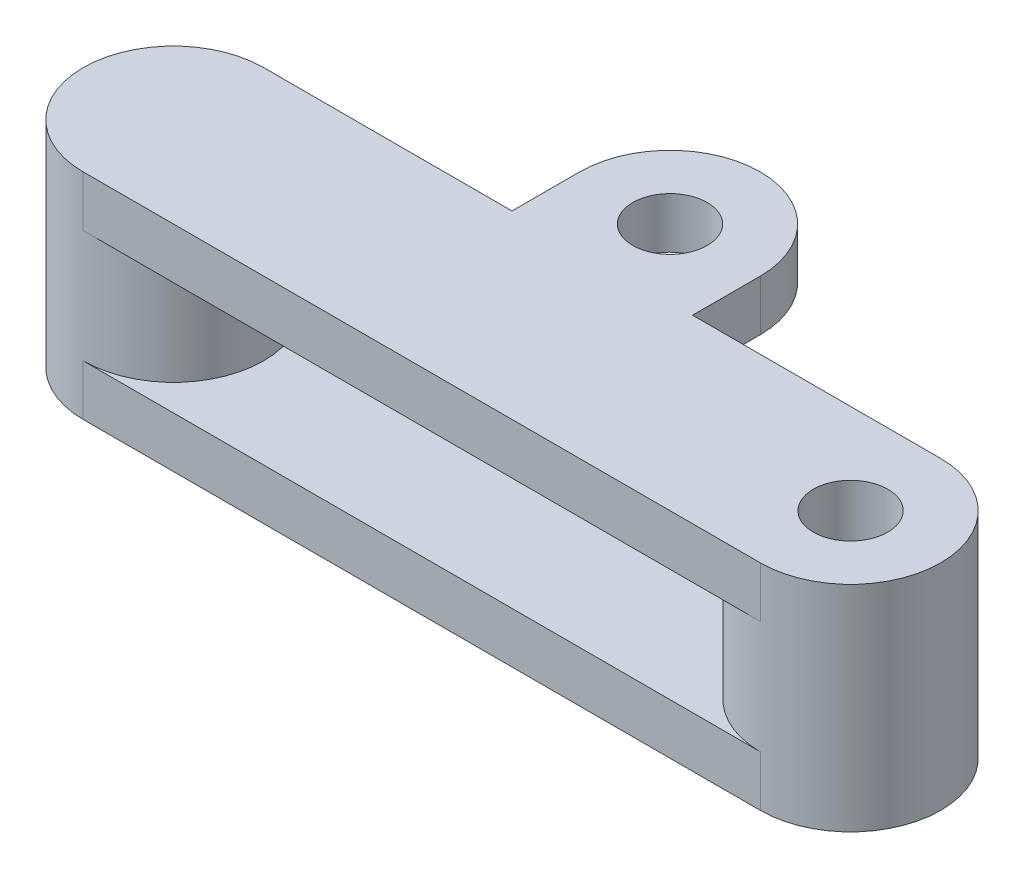
ISO-10303-21;
HEADER;
FILE_DESCRIPTION(('STEP AP214'),'2;1');
FILE_NAME('part.step','',(''),(''),'','','');
FILE_SCHEMA(('AUTOMOTIVE_DESIGN { 1 0 10303 214 1 1 1 1 }'));
ENDSEC;
DATA;
#1=APPLICATION_CONTEXT('core data for automotive mechanical design processes');
#2=APPLICATION_PROTOCOL_DEFINITION('international standard','automotive_design',2000,#1);
#3=PRODUCT_CONTEXT('',#1,'mechanical');
#4=PRODUCT('Part','Part','',(#3));
#5=PRODUCT_RELATED_PRODUCT_CATEGORY('part','',(#4));
#6=PRODUCT_DEFINITION_FORMATION('','',#4);
#7=PRODUCT_DEFINITION_CONTEXT('part definition',#1,'design');
#8=PRODUCT_DEFINITION('design','',#6,#7);
#9=PRODUCT_DEFINITION_SHAPE('','',#8);
#10=(LENGTH_UNIT() NAMED_UNIT(*) SI_UNIT(.MILLI.,.METRE.));
#11=(NAMED_UNIT(*) PLANE_ANGLE_UNIT() SI_UNIT($,.RADIAN.));
#12=(NAMED_UNIT(*) SI_UNIT($,.STERADIAN.) SOLID_ANGLE_UNIT());
#13=UNCERTAINTY_MEASURE_WITH_UNIT(LENGTH_MEASURE(1.E-05),#10,'distance_accuracy_value','');
#14=(GEOMETRIC_REPRESENTATION_CONTEXT(3) GLOBAL_UNCERTAINTY_ASSIGNED_CONTEXT((#13)) GLOBAL_UNIT_ASSIGNED_CONTEXT((#10,
#11,#12)) REPRESENTATION_CONTEXT('',''));
#15=CARTESIAN_POINT('',(0.,0.,0.));
#16=DIRECTION('',(0.,0.,1.));
#17=DIRECTION('',(1.,0.,0.));
#18=AXIS2_PLACEMENT_3D('',#15,#16,#17);
#19=CARTESIAN_POINT('',(0.,9.5,-4.));
#20=DIRECTION('',(0.,0.,1.));
#21=DIRECTION('',(1.,0.,0.));
#22=AXIS2_PLACEMENT_3D('',#19,#20,#21);
#23=PLANE('',#22);
#24=DIRECTION('',(-1.,0.,0.));
#25=VECTOR('',#24,1.);
#26=CARTESIAN_POINT('',(0.,2.25,-4.));
#27=LINE('',#26,#25);
#28=CARTESIAN_POINT('',(0.,2.25,-4.));
#29=VERTEX_POINT('',#28);
#30=CARTESIAN_POINT('',(-11.,2.25,-4.));
#31=VERTEX_POINT('',#30);
#32=EDGE_CURVE('E158',#29,#31,#27,.T.);
#33=ORIENTED_EDGE('',*,*,#32,.F.);
#34=DIRECTION('',(0.,-1.,0.));
#35=VECTOR('',#34,1.);
#36=CARTESIAN_POINT('',(0.,9.5,-4.));
#37=LINE('',#36,#35);
#38=CARTESIAN_POINT('',(0.,0.,-4.));
#39=VERTEX_POINT('',#38);
#40=EDGE_CURVE('E53',#29,#39,#37,.T.);
#41=ORIENTED_EDGE('',*,*,#40,.T.);
#42=DIRECTION('',(-1.,0.,0.));
#43=VECTOR('',#42,1.);
#44=CARTESIAN_POINT('',(0.,0.,-4.));
#45=LINE('',#44,#43);
#46=CARTESIAN_POINT('',(-11.,0.,-4.));
#47=VERTEX_POINT('',#46);
#48=EDGE_CURVE('E251',#39,#47,#45,.T.);
#49=ORIENTED_EDGE('',*,*,#48,.T.);
#50=DIRECTION('',(0.,-1.,0.));
#51=VECTOR('',#50,1.);
#52=CARTESIAN_POINT('',(-11.,9.5,-4.));
#53=LINE('',#52,#51);
#54=EDGE_CURVE('E170',#31,#47,#53,.T.);
#55=ORIENTED_EDGE('',*,*,#54,.F.);
#56=EDGE_LOOP('',(#33,#41,#49,#55));
#57=FACE_BOUND('',#56,.T.);
#58=ADVANCED_FACE('F43',(#57),#23,.F.);
#59=CARTESIAN_POINT('',(-11.,9.5,-7.));
#60=DIRECTION('',(-1.,0.,0.));
#61=DIRECTION('',(0.,0.,1.));
#62=AXIS2_PLACEMENT_3D('',#59,#60,#61);
#63=PLANE('',#62);
#64=DIRECTION('',(0.,0.,-1.));
#65=VECTOR('',#64,1.);
#66=CARTESIAN_POINT('',(-11.,2.25,-4.));
#67=LINE('',#66,#65);
#68=CARTESIAN_POINT('',(-11.,2.25,-7.));
#69=VERTEX_POINT('',#68);
#70=EDGE_CURVE('E172',#31,#69,#67,.T.);
#71=ORIENTED_EDGE('',*,*,#70,.F.);
#72=ORIENTED_EDGE('',*,*,#54,.T.);
#73=DIRECTION('',(0.,0.,-1.));
#74=VECTOR('',#73,1.);
#75=CARTESIAN_POINT('',(-11.,0.,-7.));
#76=LINE('',#75,#74);
#77=CARTESIAN_POINT('',(-11.,0.,-7.));
#78=VERTEX_POINT('',#77);
#79=EDGE_CURVE('E254',#47,#78,#76,.T.);
#80=ORIENTED_EDGE('',*,*,#79,.T.);
#81=DIRECTION('',(0.,-1.,0.));
#82=VECTOR('',#81,1.);
#83=CARTESIAN_POINT('',(-11.,9.5,-7.));
#84=LINE('',#83,#82);
#85=EDGE_CURVE('E298',#69,#78,#84,.T.);
#86=ORIENTED_EDGE('',*,*,#85,.F.);
#87=EDGE_LOOP('',(#71,#72,#80,#86));
#88=FACE_BOUND('',#87,.T.);
#89=ADVANCED_FACE('F318',(#88),#63,.F.);
#90=CARTESIAN_POINT('',(-15.,9.5,-7.));
#91=DIRECTION('',(0.,-1.,0.));
#92=DIRECTION('',(0.,0.,-1.));
#93=AXIS2_PLACEMENT_3D('',#90,#91,#92);
#94=CYLINDRICAL_SURFACE('',#93,4.);
#95=CARTESIAN_POINT('',(-15.,2.25,-7.));
#96=DIRECTION('',(0.,1.,0.));
#97=DIRECTION('',(0.,0.,1.));
#98=AXIS2_PLACEMENT_3D('',#95,#96,#97);
#99=CIRCLE('',#98,4.);
#100=CARTESIAN_POINT('',(-19.,2.25,-7.));
#101=VERTEX_POINT('',#100);
#102=EDGE_CURVE('E315',#69,#101,#99,.T.);
#103=ORIENTED_EDGE('',*,*,#102,.F.);
#104=ORIENTED_EDGE('',*,*,#85,.T.);
#105=CARTESIAN_POINT('',(-15.,0.,-7.));
#106=DIRECTION('',(0.,1.,0.));
#107=DIRECTION('',(0.,0.,1.));
#108=AXIS2_PLACEMENT_3D('',#105,#106,#107);
#109=CIRCLE('',#108,4.);
#110=CARTESIAN_POINT('',(-19.,0.,-7.));
#111=VERTEX_POINT('',#110);
#112=EDGE_CURVE('E258',#78,#111,#109,.T.);
#113=ORIENTED_EDGE('',*,*,#112,.T.);
#114=DIRECTION('',(0.,-1.,0.));
#115=VECTOR('',#114,1.);
#116=CARTESIAN_POINT('',(-19.,9.5,-7.));
#117=LINE('',#116,#115);
#118=EDGE_CURVE('E294',#101,#111,#117,.T.);
#119=ORIENTED_EDGE('',*,*,#118,.F.);
#120=EDGE_LOOP('',(#103,#104,#113,#119));
#121=FACE_BOUND('',#120,.T.);
#122=ADVANCED_FACE('F311',(#121),#94,.T.);
#123=CARTESIAN_POINT('',(-19.,9.5,-7.));
#124=DIRECTION('',(1.,0.,0.));
#125=DIRECTION('',(0.,0.,-1.));
#126=AXIS2_PLACEMENT_3D('',#123,#124,#125);
#127=PLANE('',#126);
#128=DIRECTION('',(0.,0.,1.));
#129=VECTOR('',#128,1.);
#130=CARTESIAN_POINT('',(-19.,2.25,-7.));
#131=LINE('',#130,#129);
#132=CARTESIAN_POINT('',(-19.,2.25,-4.));
#133=VERTEX_POINT('',#132);
#134=EDGE_CURVE('E328',#101,#133,#131,.T.);
#135=ORIENTED_EDGE('',*,*,#134,.F.);
#136=ORIENTED_EDGE('',*,*,#118,.T.);
#137=DIRECTION('',(0.,0.,1.));
#138=VECTOR('',#137,1.);
#139=CARTESIAN_POINT('',(-19.,0.,-7.));
#140=LINE('',#139,#138);
#141=CARTESIAN_POINT('',(-19.,0.,-4.));
#142=VERTEX_POINT('',#141);
#143=EDGE_CURVE('E262',#111,#142,#140,.T.);
#144=ORIENTED_EDGE('',*,*,#143,.T.);
#145=DIRECTION('',(0.,-1.,0.));
#146=VECTOR('',#145,1.);
#147=CARTESIAN_POINT('',(-19.,9.5,-4.));
#148=LINE('',#147,#146);
#149=EDGE_CURVE('E289',#133,#142,#148,.T.);
#150=ORIENTED_EDGE('',*,*,#149,.F.);
#151=EDGE_LOOP('',(#135,#136,#144,#150));
#152=FACE_BOUND('',#151,.T.);
#153=ADVANCED_FACE('F327',(#152),#127,.F.);
#154=CARTESIAN_POINT('',(-19.,9.5,-4.));
#155=DIRECTION('',(0.,0.,1.));
#156=DIRECTION('',(1.,0.,0.));
#157=AXIS2_PLACEMENT_3D('',#154,#155,#156);
#158=PLANE('',#157);
#159=DIRECTION('',(-1.,0.,0.));
#160=VECTOR('',#159,1.);
#161=CARTESIAN_POINT('',(-19.,2.25,-4.));
#162=LINE('',#161,#160);
#163=CARTESIAN_POINT('',(-30.,2.25,-4.));
#164=VERTEX_POINT('',#163);
#165=EDGE_CURVE('E61',#133,#164,#162,.T.);
#166=ORIENTED_EDGE('',*,*,#165,.F.);
#167=ORIENTED_EDGE('',*,*,#149,.T.);
#168=DIRECTION('',(-1.,0.,0.));
#169=VECTOR('',#168,1.);
#170=CARTESIAN_POINT('',(-19.,0.,-4.));
#171=LINE('',#170,#169);
#172=CARTESIAN_POINT('',(-30.,0.,-4.));
#173=VERTEX_POINT('',#172);
#174=EDGE_CURVE('E266',#142,#173,#171,.T.);
#175=ORIENTED_EDGE('',*,*,#174,.T.);
#176=DIRECTION('',(0.,-1.,0.));
#177=VECTOR('',#176,1.);
#178=CARTESIAN_POINT('',(-30.,9.5,-4.));
#179=LINE('',#178,#177);
#180=EDGE_CURVE('E284',#164,#173,#179,.T.);
#181=ORIENTED_EDGE('',*,*,#180,.F.);
#182=EDGE_LOOP('',(#166,#167,#175,#181));
#183=FACE_BOUND('',#182,.T.);
#184=ADVANCED_FACE('F343',(#183),#158,.F.);
#185=CARTESIAN_POINT('',(0.,9.5,4.));
#186=DIRECTION('',(0.,0.,-1.));
#187=DIRECTION('',(-1.,0.,0.));
#188=AXIS2_PLACEMENT_3D('',#185,#186,#187);
#189=PLANE('',#188);
#190=DIRECTION('',(1.,0.,0.));
#191=VECTOR('',#190,1.);
#192=CARTESIAN_POINT('',(-30.,2.25,4.));
#193=LINE('',#192,#191);
#194=CARTESIAN_POINT('',(-30.,2.25,4.));
#195=VERTEX_POINT('',#194);
#196=CARTESIAN_POINT('',(0.,2.25,4.));
#197=VERTEX_POINT('',#196);
#198=EDGE_CURVE('E160',#195,#197,#193,.T.);
#199=ORIENTED_EDGE('',*,*,#198,.F.);
#200=DIRECTION('',(0.,-1.,0.));
#201=VECTOR('',#200,1.);
#202=CARTESIAN_POINT('',(-30.,9.5,4.));
#203=LINE('',#202,#201);
#204=CARTESIAN_POINT('',(-30.,0.,4.));
#205=VERTEX_POINT('',#204);
#206=EDGE_CURVE('E280',#195,#205,#203,.T.);
#207=ORIENTED_EDGE('',*,*,#206,.T.);
#208=DIRECTION('',(1.,0.,0.));
#209=VECTOR('',#208,1.);
#210=CARTESIAN_POINT('',(0.,0.,4.));
#211=LINE('',#210,#209);
#212=CARTESIAN_POINT('',(0.,0.,4.));
#213=VERTEX_POINT('',#212);
#214=EDGE_CURVE('E227',#205,#213,#211,.T.);
#215=ORIENTED_EDGE('',*,*,#214,.T.);
#216=DIRECTION('',(0.,-1.,0.));
#217=VECTOR('',#216,1.);
#218=CARTESIAN_POINT('',(0.,9.5,4.));
#219=LINE('',#218,#217);
#220=EDGE_CURVE('E248',#197,#213,#219,.T.);
#221=ORIENTED_EDGE('',*,*,#220,.F.);
#222=EDGE_LOOP('',(#199,#207,#215,#221));
#223=FACE_BOUND('',#222,.T.);
#224=ADVANCED_FACE('F336',(#223),#189,.F.);
#225=CARTESIAN_POINT('',(-15.,9.5,-7.));
#226=DIRECTION('',(0.,-1.,0.));
#227=DIRECTION('',(0.,0.,-1.));
#228=AXIS2_PLACEMENT_3D('',#225,#226,#227);
#229=CYLINDRICAL_SURFACE('',#228,1.65);
#230=CARTESIAN_POINT('',(-15.,0.,-7.));
#231=DIRECTION('',(0.,1.,0.));
#232=DIRECTION('',(0.,0.,1.));
#233=AXIS2_PLACEMENT_3D('',#230,#231,#232);
#234=CIRCLE('',#233,1.65);
#235=CARTESIAN_POINT('',(-15.,0.,-5.35));
#236=VERTEX_POINT('',#235);
#237=EDGE_CURVE('E193',#236,#236,#234,.T.);
#238=ORIENTED_EDGE('',*,*,#237,.F.);
#239=EDGE_LOOP('',(#238));
#240=FACE_BOUND('',#239,.T.);
#241=CARTESIAN_POINT('',(-15.,2.25,-7.));
#242=DIRECTION('',(0.,1.,0.));
#243=DIRECTION('',(0.,0.,1.));
#244=AXIS2_PLACEMENT_3D('',#241,#242,#243);
#245=CIRCLE('',#244,1.65);
#246=CARTESIAN_POINT('',(-15.,2.25,-5.35));
#247=VERTEX_POINT('',#246);
#248=EDGE_CURVE('E184',#247,#247,#245,.T.);
#249=ORIENTED_EDGE('',*,*,#248,.T.);
#250=EDGE_LOOP('',(#249));
#251=FACE_BOUND('',#250,.T.);
#252=ADVANCED_FACE('F431',(#240,#251),#229,.F.);
#253=CARTESIAN_POINT('',(0.,9.5,0.));
#254=DIRECTION('',(0.,1.,0.));
#255=DIRECTION('',(0.,0.,1.));
#256=AXIS2_PLACEMENT_3D('',#253,#254,#255);
#257=PLANE('',#256);
#258=CARTESIAN_POINT('',(0.,9.5,0.));
#259=DIRECTION('',(0.,1.,0.));
#260=DIRECTION('',(0.,0.,1.));
#261=AXIS2_PLACEMENT_3D('',#258,#259,#260);
#262=CIRCLE('',#261,1.65);
#263=CARTESIAN_POINT('',(0.,9.5,1.65));
#264=VERTEX_POINT('',#263);
#265=EDGE_CURVE('E215',#264,#264,#262,.T.);
#266=ORIENTED_EDGE('',*,*,#265,.F.);
#267=EDGE_LOOP('',(#266));
#268=FACE_BOUND('',#267,.T.);
#269=CARTESIAN_POINT('',(0.,9.5,0.));
#270=DIRECTION('',(0.,1.,0.));
#271=DIRECTION('',(0.,0.,1.));
#272=AXIS2_PLACEMENT_3D('',#269,#270,#271);
#273=CIRCLE('',#272,4.);
#274=CARTESIAN_POINT('',(0.,9.5,4.));
#275=VERTEX_POINT('',#274);
#276=CARTESIAN_POINT('',(0.,9.5,-4.));
#277=VERTEX_POINT('',#276);
#278=EDGE_CURVE('E222',#275,#277,#273,.T.);
#279=ORIENTED_EDGE('',*,*,#278,.T.);
#280=DIRECTION('',(-1.,0.,0.));
#281=VECTOR('',#280,1.);
#282=CARTESIAN_POINT('',(0.,9.5,-4.));
#283=LINE('',#282,#281);
#284=CARTESIAN_POINT('',(-11.,9.5,-4.));
#285=VERTEX_POINT('',#284);
#286=EDGE_CURVE('E226',#277,#285,#283,.T.);
#287=ORIENTED_EDGE('',*,*,#286,.T.);
#288=DIRECTION('',(0.,0.,-1.));
#289=VECTOR('',#288,1.);
#290=CARTESIAN_POINT('',(-11.,9.5,-7.));
#291=LINE('',#290,#289);
#292=CARTESIAN_POINT('',(-11.,9.5,-7.));
#293=VERTEX_POINT('',#292);
#294=EDGE_CURVE('E230',#285,#293,#291,.T.);
#295=ORIENTED_EDGE('',*,*,#294,.T.);
#296=CARTESIAN_POINT('',(-15.,9.5,-7.));
#297=DIRECTION('',(0.,1.,0.));
#298=DIRECTION('',(0.,0.,1.));
#299=AXIS2_PLACEMENT_3D('',#296,#297,#298);
#300=CIRCLE('',#299,4.);
#301=CARTESIAN_POINT('',(-19.,9.5,-7.));
#302=VERTEX_POINT('',#301);
#303=EDGE_CURVE('E233',#293,#302,#300,.T.);
#304=ORIENTED_EDGE('',*,*,#303,.T.);
#305=DIRECTION('',(0.,0.,1.));
#306=VECTOR('',#305,1.);
#307=CARTESIAN_POINT('',(-19.,9.5,-7.));
#308=LINE('',#307,#306);
#309=CARTESIAN_POINT('',(-19.,9.5,-4.));
#310=VERTEX_POINT('',#309);
#311=EDGE_CURVE('E236',#302,#310,#308,.T.);
#312=ORIENTED_EDGE('',*,*,#311,.T.);
#313=DIRECTION('',(-1.,0.,0.));
#314=VECTOR('',#313,1.);
#315=CARTESIAN_POINT('',(-19.,9.5,-4.));
#316=LINE('',#315,#314);
#317=CARTESIAN_POINT('',(-30.,9.5,-4.));
#318=VERTEX_POINT('',#317);
#319=EDGE_CURVE('E239',#310,#318,#316,.T.);
#320=ORIENTED_EDGE('',*,*,#319,.T.);
#321=CARTESIAN_POINT('',(-30.,9.5,0.));
#322=DIRECTION('',(0.,1.,0.));
#323=DIRECTION('',(0.,0.,1.));
#324=AXIS2_PLACEMENT_3D('',#321,#322,#323);
#325=CIRCLE('',#324,4.);
#326=CARTESIAN_POINT('',(-30.,9.5,4.));
#327=VERTEX_POINT('',#326);
#328=EDGE_CURVE('E242',#318,#327,#325,.T.);
#329=ORIENTED_EDGE('',*,*,#328,.T.);
#330=DIRECTION('',(1.,0.,0.));
#331=VECTOR('',#330,1.);
#332=CARTESIAN_POINT('',(0.,9.5,4.));
#333=LINE('',#332,#331);
#334=EDGE_CURVE('E245',#327,#275,#333,.T.);
#335=ORIENTED_EDGE('',*,*,#334,.T.);
#336=EDGE_LOOP('',(#279,#287,#295,#304,#312,#320,#329,#335));
#337=FACE_BOUND('',#336,.T.);
#338=CARTESIAN_POINT('',(-15.,9.5,-7.));
#339=DIRECTION('',(0.,1.,0.));
#340=DIRECTION('',(0.,0.,1.));
#341=AXIS2_PLACEMENT_3D('',#338,#339,#340);
#342=CIRCLE('',#341,1.65);
#343=CARTESIAN_POINT('',(-15.,9.5,-5.35));
#344=VERTEX_POINT('',#343);
#345=EDGE_CURVE('E207',#344,#344,#342,.T.);
#346=ORIENTED_EDGE('',*,*,#345,.F.);
#347=EDGE_LOOP('',(#346));
#348=FACE_BOUND('',#347,.T.);
#349=ADVANCED_FACE('F384',(#268,#337,#348),#257,.T.);
#350=CARTESIAN_POINT('',(0.,0.,0.));
#351=DIRECTION('',(0.,1.,0.));
#352=DIRECTION('',(0.,0.,1.));
#353=AXIS2_PLACEMENT_3D('',#350,#351,#352);
#354=PLANE('',#353);
#355=CARTESIAN_POINT('',(0.,0.,0.));
#356=DIRECTION('',(0.,1.,0.));
#357=DIRECTION('',(0.,0.,1.));
#358=AXIS2_PLACEMENT_3D('',#355,#356,#357);
#359=CIRCLE('',#358,4.);
#360=EDGE_CURVE('E177',#213,#39,#359,.T.);
#361=ORIENTED_EDGE('',*,*,#360,.F.);
#362=ORIENTED_EDGE('',*,*,#214,.F.);
#363=CARTESIAN_POINT('',(-30.,0.,0.));
#364=DIRECTION('',(0.,1.,0.));
#365=DIRECTION('',(0.,0.,1.));
#366=AXIS2_PLACEMENT_3D('',#363,#364,#365);
#367=CIRCLE('',#366,4.);
#368=EDGE_CURVE('E270',#173,#205,#367,.T.);
#369=ORIENTED_EDGE('',*,*,#368,.F.);
#370=ORIENTED_EDGE('',*,*,#174,.F.);
#371=ORIENTED_EDGE('',*,*,#143,.F.);
#372=ORIENTED_EDGE('',*,*,#112,.F.);
#373=ORIENTED_EDGE('',*,*,#79,.F.);
#374=ORIENTED_EDGE('',*,*,#48,.F.);
#375=EDGE_LOOP('',(#361,#362,#369,#370,#371,#372,#373,#374));
#376=FACE_BOUND('',#375,.T.);
#377=CARTESIAN_POINT('',(0.,0.,0.));
#378=DIRECTION('',(0.,1.,0.));
#379=DIRECTION('',(0.,0.,1.));
#380=AXIS2_PLACEMENT_3D('',#377,#378,#379);
#381=CIRCLE('',#380,1.65);
#382=CARTESIAN_POINT('',(0.,0.,1.65));
#383=VERTEX_POINT('',#382);
#384=EDGE_CURVE('E211',#383,#383,#381,.T.);
#385=ORIENTED_EDGE('',*,*,#384,.T.);
#386=EDGE_LOOP('',(#385));
#387=FACE_BOUND('',#386,.T.);
#388=ORIENTED_EDGE('',*,*,#237,.T.);
#389=EDGE_LOOP('',(#388));
#390=FACE_BOUND('',#389,.T.);
#391=ADVANCED_FACE('F320',(#376,#387,#390),#354,.F.);
#392=CARTESIAN_POINT('',(0.,9.5,0.));
#393=DIRECTION('',(0.,-1.,0.));
#394=DIRECTION('',(0.,0.,-1.));
#395=AXIS2_PLACEMENT_3D('',#392,#393,#394);
#396=CYLINDRICAL_SURFACE('',#395,4.);
#397=ORIENTED_EDGE('',*,*,#40,.F.);
#398=CARTESIAN_POINT('',(0.,2.25,0.));
#399=DIRECTION('',(0.,-1.,0.));
#400=DIRECTION('',(0.,0.,1.));
#401=AXIS2_PLACEMENT_3D('',#398,#399,#400);
#402=CIRCLE('',#401,4.);
#403=EDGE_CURVE('E155',#197,#29,#402,.T.);
#404=ORIENTED_EDGE('',*,*,#403,.F.);
#405=ORIENTED_EDGE('',*,*,#220,.T.);
#406=ORIENTED_EDGE('',*,*,#360,.T.);
#407=EDGE_LOOP('',(#397,#404,#405,#406));
#408=FACE_BOUND('',#407,.T.);
#409=CARTESIAN_POINT('',(0.,7.25,0.));
#410=DIRECTION('',(0.,-1.,0.));
#411=DIRECTION('',(0.,0.,1.));
#412=AXIS2_PLACEMENT_3D('',#409,#410,#411);
#413=CIRCLE('',#412,4.);
#414=CARTESIAN_POINT('',(0.,7.25,4.));
#415=VERTEX_POINT('',#414);
#416=CARTESIAN_POINT('',(0.,7.25,-4.));
#417=VERTEX_POINT('',#416);
#418=EDGE_CURVE('E354',#415,#417,#413,.T.);
#419=ORIENTED_EDGE('',*,*,#418,.T.);
#420=EDGE_CURVE('E11',#277,#417,#37,.T.);
#421=ORIENTED_EDGE('',*,*,#420,.F.);
#422=ORIENTED_EDGE('',*,*,#278,.F.);
#423=EDGE_CURVE('E277',#275,#415,#219,.T.);
#424=ORIENTED_EDGE('',*,*,#423,.T.);
#425=EDGE_LOOP('',(#419,#421,#422,#424));
#426=FACE_BOUND('',#425,.T.);
#427=ADVANCED_FACE('F45',(#408,#426),#396,.T.);
#428=ORIENTED_EDGE('',*,*,#420,.T.);
#429=DIRECTION('',(-1.,0.,0.));
#430=VECTOR('',#429,1.);
#431=CARTESIAN_POINT('',(0.,7.25,-4.));
#432=LINE('',#431,#430);
#433=CARTESIAN_POINT('',(-11.,7.25,-4.));
#434=VERTEX_POINT('',#433);
#435=EDGE_CURVE('E358',#417,#434,#432,.T.);
#436=ORIENTED_EDGE('',*,*,#435,.T.);
#437=EDGE_CURVE('E179',#285,#434,#53,.T.);
#438=ORIENTED_EDGE('',*,*,#437,.F.);
#439=ORIENTED_EDGE('',*,*,#286,.F.);
#440=EDGE_LOOP('',(#428,#436,#438,#439));
#441=FACE_BOUND('',#440,.T.);
#442=ADVANCED_FACE('F400',(#441),#23,.F.);
#443=ORIENTED_EDGE('',*,*,#437,.T.);
#444=DIRECTION('',(0.,0.,-1.));
#445=VECTOR('',#444,1.);
#446=CARTESIAN_POINT('',(-11.,7.25,-4.));
#447=LINE('',#446,#445);
#448=CARTESIAN_POINT('',(-11.,7.25,-7.));
#449=VERTEX_POINT('',#448);
#450=EDGE_CURVE('E362',#434,#449,#447,.T.);
#451=ORIENTED_EDGE('',*,*,#450,.T.);
#452=EDGE_CURVE('E299',#293,#449,#84,.T.);
#453=ORIENTED_EDGE('',*,*,#452,.F.);
#454=ORIENTED_EDGE('',*,*,#294,.F.);
#455=EDGE_LOOP('',(#443,#451,#453,#454));
#456=FACE_BOUND('',#455,.T.);
#457=ADVANCED_FACE('F393',(#456),#63,.F.);
#458=ORIENTED_EDGE('',*,*,#452,.T.);
#459=CARTESIAN_POINT('',(-15.,7.25,-7.));
#460=DIRECTION('',(0.,1.,0.));
#461=DIRECTION('',(0.,0.,1.));
#462=AXIS2_PLACEMENT_3D('',#459,#460,#461);
#463=CIRCLE('',#462,4.);
#464=CARTESIAN_POINT('',(-19.,7.25,-7.));
#465=VERTEX_POINT('',#464);
#466=EDGE_CURVE('E366',#449,#465,#463,.T.);
#467=ORIENTED_EDGE('',*,*,#466,.T.);
#468=EDGE_CURVE('E295',#302,#465,#117,.T.);
#469=ORIENTED_EDGE('',*,*,#468,.F.);
#470=ORIENTED_EDGE('',*,*,#303,.F.);
#471=EDGE_LOOP('',(#458,#467,#469,#470));
#472=FACE_BOUND('',#471,.T.);
#473=ADVANCED_FACE('F391',(#472),#94,.T.);
#474=ORIENTED_EDGE('',*,*,#468,.T.);
#475=DIRECTION('',(0.,0.,1.));
#476=VECTOR('',#475,1.);
#477=CARTESIAN_POINT('',(-19.,7.25,-7.));
#478=LINE('',#477,#476);
#479=CARTESIAN_POINT('',(-19.,7.25,-4.));
#480=VERTEX_POINT('',#479);
#481=EDGE_CURVE('E369',#465,#480,#478,.T.);
#482=ORIENTED_EDGE('',*,*,#481,.T.);
#483=EDGE_CURVE('E290',#310,#480,#148,.T.);
#484=ORIENTED_EDGE('',*,*,#483,.F.);
#485=ORIENTED_EDGE('',*,*,#311,.F.);
#486=EDGE_LOOP('',(#474,#482,#484,#485));
#487=FACE_BOUND('',#486,.T.);
#488=ADVANCED_FACE('F389',(#487),#127,.F.);
#489=ORIENTED_EDGE('',*,*,#483,.T.);
#490=DIRECTION('',(-1.,0.,0.));
#491=VECTOR('',#490,1.);
#492=CARTESIAN_POINT('',(-19.,7.25,-4.));
#493=LINE('',#492,#491);
#494=CARTESIAN_POINT('',(-30.,7.25,-4.));
#495=VERTEX_POINT('',#494);
#496=EDGE_CURVE('E203',#480,#495,#493,.T.);
#497=ORIENTED_EDGE('',*,*,#496,.T.);
#498=EDGE_CURVE('E285',#318,#495,#179,.T.);
#499=ORIENTED_EDGE('',*,*,#498,.F.);
#500=ORIENTED_EDGE('',*,*,#319,.F.);
#501=EDGE_LOOP('',(#489,#497,#499,#500));
#502=FACE_BOUND('',#501,.T.);
#503=ADVANCED_FACE('F376',(#502),#158,.F.);
#504=CARTESIAN_POINT('',(-30.,9.5,0.));
#505=DIRECTION('',(0.,-1.,0.));
#506=DIRECTION('',(0.,0.,-1.));
#507=AXIS2_PLACEMENT_3D('',#504,#505,#506);
#508=CYLINDRICAL_SURFACE('',#507,4.);
#509=CARTESIAN_POINT('',(-30.,2.25,0.));
#510=DIRECTION('',(0.,-1.,0.));
#511=DIRECTION('',(0.,0.,1.));
#512=AXIS2_PLACEMENT_3D('',#509,#510,#511);
#513=CIRCLE('',#512,4.);
#514=EDGE_CURVE('E65',#164,#195,#513,.T.);
#515=ORIENTED_EDGE('',*,*,#514,.F.);
#516=ORIENTED_EDGE('',*,*,#180,.T.);
#517=ORIENTED_EDGE('',*,*,#368,.T.);
#518=ORIENTED_EDGE('',*,*,#206,.F.);
#519=EDGE_LOOP('',(#515,#516,#517,#518));
#520=FACE_BOUND('',#519,.T.);
#521=ORIENTED_EDGE('',*,*,#498,.T.);
#522=CARTESIAN_POINT('',(-30.,7.25,0.));
#523=DIRECTION('',(0.,-1.,0.));
#524=DIRECTION('',(0.,0.,1.));
#525=AXIS2_PLACEMENT_3D('',#522,#523,#524);
#526=CIRCLE('',#525,4.);
#527=CARTESIAN_POINT('',(-30.,7.25,4.));
#528=VERTEX_POINT('',#527);
#529=EDGE_CURVE('E195',#495,#528,#526,.T.);
#530=ORIENTED_EDGE('',*,*,#529,.T.);
#531=EDGE_CURVE('E281',#327,#528,#203,.T.);
#532=ORIENTED_EDGE('',*,*,#531,.F.);
#533=ORIENTED_EDGE('',*,*,#328,.F.);
#534=EDGE_LOOP('',(#521,#530,#532,#533));
#535=FACE_BOUND('',#534,.T.);
#536=ADVANCED_FACE('F339',(#520,#535),#508,.T.);
#537=ORIENTED_EDGE('',*,*,#531,.T.);
#538=DIRECTION('',(1.,0.,0.));
#539=VECTOR('',#538,1.);
#540=CARTESIAN_POINT('',(-30.,7.25,4.));
#541=LINE('',#540,#539);
#542=EDGE_CURVE('E187',#528,#415,#541,.T.);
#543=ORIENTED_EDGE('',*,*,#542,.T.);
#544=ORIENTED_EDGE('',*,*,#423,.F.);
#545=ORIENTED_EDGE('',*,*,#334,.F.);
#546=EDGE_LOOP('',(#537,#543,#544,#545));
#547=FACE_BOUND('',#546,.T.);
#548=ADVANCED_FACE('F417',(#547),#189,.F.);
#549=CARTESIAN_POINT('',(0.,9.5,0.));
#550=DIRECTION('',(0.,-1.,0.));
#551=DIRECTION('',(0.,0.,-1.));
#552=AXIS2_PLACEMENT_3D('',#549,#550,#551);
#553=CYLINDRICAL_SURFACE('',#552,1.65);
#554=ORIENTED_EDGE('',*,*,#265,.T.);
#555=EDGE_LOOP('',(#554));
#556=FACE_BOUND('',#555,.T.);
#557=ORIENTED_EDGE('',*,*,#384,.F.);
#558=EDGE_LOOP('',(#557));
#559=FACE_BOUND('',#558,.T.);
#560=ADVANCED_FACE('F419',(#556,#559),#553,.F.);
#561=CARTESIAN_POINT('',(-15.,7.25,-7.));
#562=DIRECTION('',(0.,1.,0.));
#563=DIRECTION('',(0.,0.,1.));
#564=AXIS2_PLACEMENT_3D('',#561,#562,#563);
#565=CIRCLE('',#564,1.65);
#566=CARTESIAN_POINT('',(-15.,7.25,-5.35));
#567=VERTEX_POINT('',#566);
#568=EDGE_CURVE('E47',#567,#567,#565,.T.);
#569=ORIENTED_EDGE('',*,*,#568,.F.);
#570=EDGE_LOOP('',(#569));
#571=FACE_BOUND('',#570,.T.);
#572=ORIENTED_EDGE('',*,*,#345,.T.);
#573=EDGE_LOOP('',(#572));
#574=FACE_BOUND('',#573,.T.);
#575=ADVANCED_FACE('F425',(#571,#574),#229,.F.);
#576=CARTESIAN_POINT('',(0.,7.25,0.));
#577=DIRECTION('',(0.,1.,0.));
#578=DIRECTION('',(0.,0.,1.));
#579=AXIS2_PLACEMENT_3D('',#576,#577,#578);
#580=PLANE('',#579);
#581=ORIENTED_EDGE('',*,*,#568,.T.);
#582=EDGE_LOOP('',(#581));
#583=FACE_BOUND('',#582,.T.);
#584=ORIENTED_EDGE('',*,*,#418,.F.);
#585=ORIENTED_EDGE('',*,*,#542,.F.);
#586=ORIENTED_EDGE('',*,*,#529,.F.);
#587=ORIENTED_EDGE('',*,*,#496,.F.);
#588=ORIENTED_EDGE('',*,*,#481,.F.);
#589=ORIENTED_EDGE('',*,*,#466,.F.);
#590=ORIENTED_EDGE('',*,*,#450,.F.);
#591=ORIENTED_EDGE('',*,*,#435,.F.);
#592=EDGE_LOOP('',(#584,#585,#586,#587,#588,#589,#590,#591));
#593=FACE_BOUND('',#592,.T.);
#594=ADVANCED_FACE('F390',(#583,#593),#580,.F.);
#595=CARTESIAN_POINT('',(0.,2.25,0.));
#596=DIRECTION('',(0.,1.,0.));
#597=DIRECTION('',(0.,0.,1.));
#598=AXIS2_PLACEMENT_3D('',#595,#596,#597);
#599=PLANE('',#598);
#600=ORIENTED_EDGE('',*,*,#248,.F.);
#601=EDGE_LOOP('',(#600));
#602=FACE_BOUND('',#601,.T.);
#603=ORIENTED_EDGE('',*,*,#403,.T.);
#604=ORIENTED_EDGE('',*,*,#32,.T.);
#605=ORIENTED_EDGE('',*,*,#70,.T.);
#606=ORIENTED_EDGE('',*,*,#102,.T.);
#607=ORIENTED_EDGE('',*,*,#134,.T.);
#608=ORIENTED_EDGE('',*,*,#165,.T.);
#609=ORIENTED_EDGE('',*,*,#514,.T.);
#610=ORIENTED_EDGE('',*,*,#198,.T.);
#611=EDGE_LOOP('',(#603,#604,#605,#606,#607,#608,#609,#610));
#612=FACE_BOUND('',#611,.T.);
#613=ADVANCED_FACE('F157',(#602,#612),#599,.T.);
#614=CLOSED_SHELL('',(#58,#89,#122,#153,#184,#224,#252,#349,#391,#427,#442,#457,#473,#488,#503,
#536,#548,#560,#575,#594,#613));
#615=MANIFOLD_SOLID_BREP('B2',#614);
#616=ADVANCED_BREP_SHAPE_REPRESENTATION('',(#18,#615),#14);
#617=SHAPE_DEFINITION_REPRESENTATION(#9,#616);
ENDSEC;
END-ISO-10303-21;
